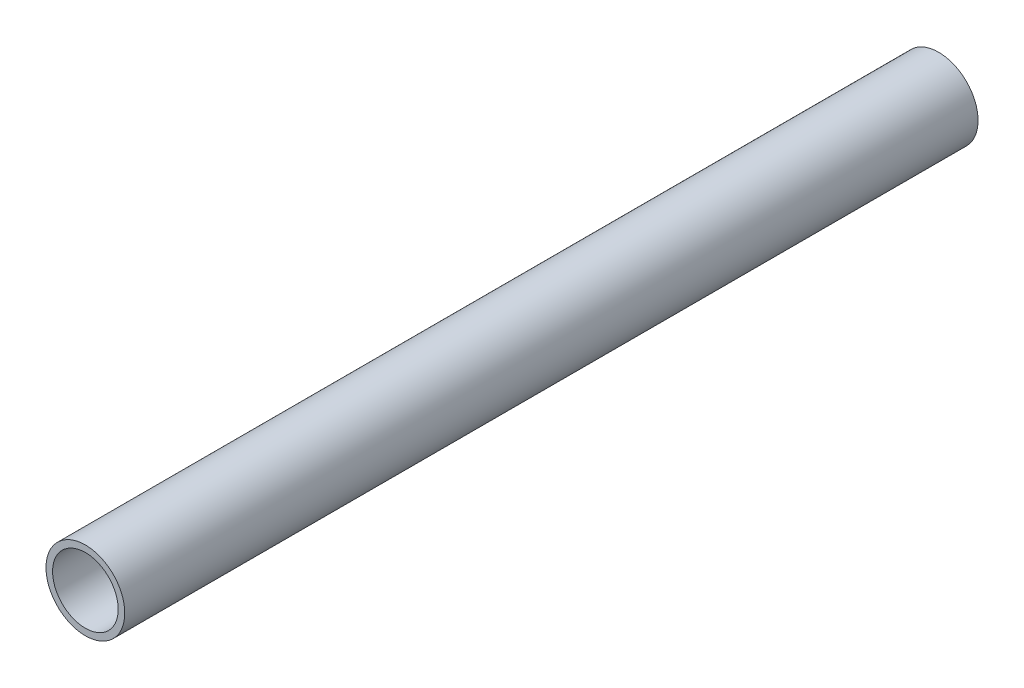
ISO-10303-21;
HEADER;
FILE_DESCRIPTION(('STEP AP214'),'2;1');
FILE_NAME('part.step','',(''),(''),'','','');
FILE_SCHEMA(('AUTOMOTIVE_DESIGN { 1 0 10303 214 1 1 1 1 }'));
ENDSEC;
DATA;
#1=APPLICATION_CONTEXT('core data for automotive mechanical design processes');
#2=APPLICATION_PROTOCOL_DEFINITION('international standard','automotive_design',2000,#1);
#3=PRODUCT_CONTEXT('',#1,'mechanical');
#4=PRODUCT('Part','Part','',(#3));
#5=PRODUCT_RELATED_PRODUCT_CATEGORY('part','',(#4));
#6=PRODUCT_DEFINITION_FORMATION('','',#4);
#7=PRODUCT_DEFINITION_CONTEXT('part definition',#1,'design');
#8=PRODUCT_DEFINITION('design','',#6,#7);
#9=PRODUCT_DEFINITION_SHAPE('','',#8);
#10=(LENGTH_UNIT() NAMED_UNIT(*) SI_UNIT(.MILLI.,.METRE.));
#11=(NAMED_UNIT(*) PLANE_ANGLE_UNIT() SI_UNIT($,.RADIAN.));
#12=(NAMED_UNIT(*) SI_UNIT($,.STERADIAN.) SOLID_ANGLE_UNIT());
#13=UNCERTAINTY_MEASURE_WITH_UNIT(LENGTH_MEASURE(1.E-05),#10,'distance_accuracy_value','');
#14=(GEOMETRIC_REPRESENTATION_CONTEXT(3) GLOBAL_UNCERTAINTY_ASSIGNED_CONTEXT((#13)) GLOBAL_UNIT_ASSIGNED_CONTEXT((#10,
#11,#12)) REPRESENTATION_CONTEXT('',''));
#15=CARTESIAN_POINT('',(0.,0.,0.));
#16=DIRECTION('',(0.,0.,1.));
#17=DIRECTION('',(1.,0.,0.));
#18=AXIS2_PLACEMENT_3D('',#15,#16,#17);
#19=CARTESIAN_POINT('',(0.,0.,130.));
#20=DIRECTION('',(0.,0.,-1.));
#21=DIRECTION('',(-1.,0.,0.));
#22=AXIS2_PLACEMENT_3D('',#19,#20,#21);
#23=CYLINDRICAL_SURFACE('',#22,5.);
#24=CARTESIAN_POINT('',(0.,0.,0.));
#25=DIRECTION('',(0.,0.,-1.));
#26=DIRECTION('',(-1.,0.,0.));
#27=AXIS2_PLACEMENT_3D('',#24,#25,#26);
#28=CIRCLE('',#27,5.);
#29=CARTESIAN_POINT('',(-5.,0.,0.));
#30=VERTEX_POINT('',#29);
#31=EDGE_CURVE('E27',#30,#30,#28,.T.);
#32=ORIENTED_EDGE('',*,*,#31,.T.);
#33=EDGE_LOOP('',(#32));
#34=FACE_BOUND('',#33,.T.);
#35=CARTESIAN_POINT('',(0.,0.,130.));
#36=DIRECTION('',(0.,0.,-1.));
#37=DIRECTION('',(-1.,0.,0.));
#38=AXIS2_PLACEMENT_3D('',#35,#36,#37);
#39=CIRCLE('',#38,5.);
#40=CARTESIAN_POINT('',(-5.,0.,130.));
#41=VERTEX_POINT('',#40);
#42=EDGE_CURVE('E17',#41,#41,#39,.T.);
#43=ORIENTED_EDGE('',*,*,#42,.F.);
#44=EDGE_LOOP('',(#43));
#45=FACE_BOUND('',#44,.T.);
#46=ADVANCED_FACE('F14',(#34,#45),#23,.F.);
#47=CARTESIAN_POINT('',(0.,0.,130.));
#48=DIRECTION('',(0.,0.,1.));
#49=DIRECTION('',(1.,0.,0.));
#50=AXIS2_PLACEMENT_3D('',#47,#48,#49);
#51=PLANE('',#50);
#52=ORIENTED_EDGE('',*,*,#42,.T.);
#53=EDGE_LOOP('',(#52));
#54=FACE_BOUND('',#53,.T.);
#55=CARTESIAN_POINT('',(0.,0.,130.));
#56=DIRECTION('',(0.,0.,-1.));
#57=DIRECTION('',(-1.,0.,0.));
#58=AXIS2_PLACEMENT_3D('',#55,#56,#57);
#59=CIRCLE('',#58,6.);
#60=CARTESIAN_POINT('',(-6.,0.,130.));
#61=VERTEX_POINT('',#60);
#62=EDGE_CURVE('E21',#61,#61,#59,.T.);
#63=ORIENTED_EDGE('',*,*,#62,.F.);
#64=EDGE_LOOP('',(#63));
#65=FACE_BOUND('',#64,.T.);
#66=ADVANCED_FACE('F37',(#54,#65),#51,.T.);
#67=CARTESIAN_POINT('',(0.,0.,0.));
#68=DIRECTION('',(0.,0.,1.));
#69=DIRECTION('',(1.,0.,0.));
#70=AXIS2_PLACEMENT_3D('',#67,#68,#69);
#71=PLANE('',#70);
#72=ORIENTED_EDGE('',*,*,#31,.F.);
#73=EDGE_LOOP('',(#72));
#74=FACE_BOUND('',#73,.T.);
#75=CARTESIAN_POINT('',(0.,0.,0.));
#76=DIRECTION('',(0.,0.,-1.));
#77=DIRECTION('',(-1.,0.,0.));
#78=AXIS2_PLACEMENT_3D('',#75,#76,#77);
#79=CIRCLE('',#78,6.);
#80=CARTESIAN_POINT('',(-6.,0.,0.));
#81=VERTEX_POINT('',#80);
#82=EDGE_CURVE('E10',#81,#81,#79,.F.);
#83=ORIENTED_EDGE('',*,*,#82,.F.);
#84=EDGE_LOOP('',(#83));
#85=FACE_BOUND('',#84,.T.);
#86=ADVANCED_FACE('F45',(#74,#85),#71,.F.);
#87=CARTESIAN_POINT('',(0.,0.,130.));
#88=DIRECTION('',(0.,0.,-1.));
#89=DIRECTION('',(-1.,0.,0.));
#90=AXIS2_PLACEMENT_3D('',#87,#88,#89);
#91=CYLINDRICAL_SURFACE('',#90,6.);
#92=ORIENTED_EDGE('',*,*,#82,.T.);
#93=EDGE_LOOP('',(#92));
#94=FACE_BOUND('',#93,.T.);
#95=ORIENTED_EDGE('',*,*,#62,.T.);
#96=EDGE_LOOP('',(#95));
#97=FACE_BOUND('',#96,.T.);
#98=ADVANCED_FACE('F46',(#94,#97),#91,.T.);
#99=CLOSED_SHELL('',(#46,#66,#86,#98));
#100=MANIFOLD_SOLID_BREP('B1',#99);
#101=ADVANCED_BREP_SHAPE_REPRESENTATION('',(#18,#100),#14);
#102=SHAPE_DEFINITION_REPRESENTATION(#9,#101);
ENDSEC;
END-ISO-10303-21;
